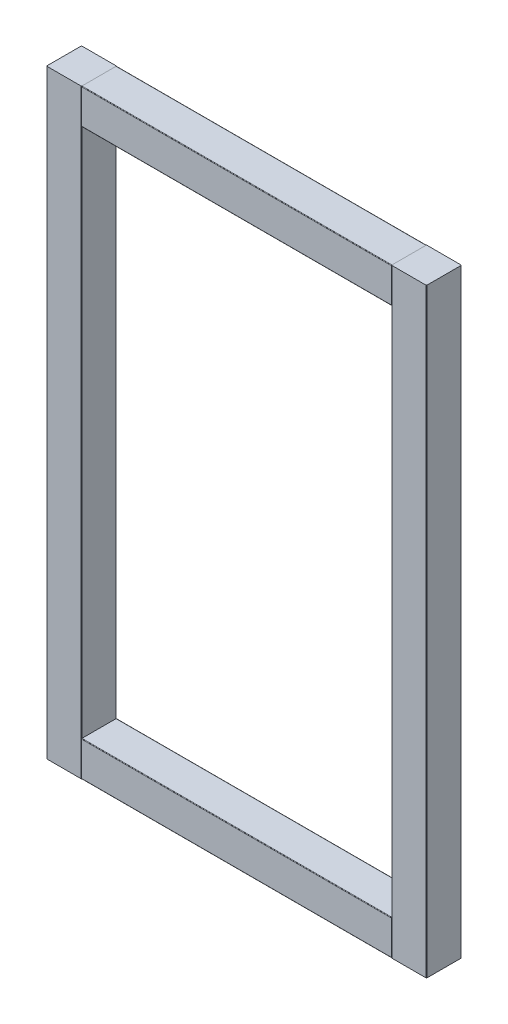
ISO-10303-21;
HEADER;
FILE_DESCRIPTION(('STEP AP214'),'2;1');
FILE_NAME('part.step','',(''),(''),'','','');
FILE_SCHEMA(('AUTOMOTIVE_DESIGN { 1 0 10303 214 1 1 1 1 }'));
ENDSEC;
DATA;
#1=APPLICATION_CONTEXT('core data for automotive mechanical design processes');
#2=APPLICATION_PROTOCOL_DEFINITION('international standard','automotive_design',2000,#1);
#3=PRODUCT_CONTEXT('',#1,'mechanical');
#4=PRODUCT('Part','Part','',(#3));
#5=PRODUCT_RELATED_PRODUCT_CATEGORY('part','',(#4));
#6=PRODUCT_DEFINITION_FORMATION('','',#4);
#7=PRODUCT_DEFINITION_CONTEXT('part definition',#1,'design');
#8=PRODUCT_DEFINITION('design','',#6,#7);
#9=PRODUCT_DEFINITION_SHAPE('','',#8);
#10=(LENGTH_UNIT() NAMED_UNIT(*) SI_UNIT(.MILLI.,.METRE.));
#11=(NAMED_UNIT(*) PLANE_ANGLE_UNIT() SI_UNIT($,.RADIAN.));
#12=(NAMED_UNIT(*) SI_UNIT($,.STERADIAN.) SOLID_ANGLE_UNIT());
#13=UNCERTAINTY_MEASURE_WITH_UNIT(LENGTH_MEASURE(1.E-05),#10,'distance_accuracy_value','');
#14=(GEOMETRIC_REPRESENTATION_CONTEXT(3) GLOBAL_UNCERTAINTY_ASSIGNED_CONTEXT((#13)) GLOBAL_UNIT_ASSIGNED_CONTEXT((#10,
#11,#12)) REPRESENTATION_CONTEXT('',''));
#15=CARTESIAN_POINT('',(0.,0.,0.));
#16=DIRECTION('',(0.,0.,1.));
#17=DIRECTION('',(1.,0.,0.));
#18=AXIS2_PLACEMENT_3D('',#15,#16,#17);
#19=CARTESIAN_POINT('',(155.5,282.5,-17.));
#20=DIRECTION('',(0.,-1.,0.));
#21=DIRECTION('',(0.,0.,-1.));
#22=AXIS2_PLACEMENT_3D('',#19,#20,#21);
#23=CYLINDRICAL_SURFACE('',#22,0.5);
#24=CARTESIAN_POINT('',(155.5,-300.,-17.));
#25=DIRECTION('',(0.,-1.,0.));
#26=DIRECTION('',(0.,0.,-1.));
#27=AXIS2_PLACEMENT_3D('',#24,#25,#26);
#28=CIRCLE('',#27,0.5);
#29=CARTESIAN_POINT('',(155.,-300.,-17.));
#30=VERTEX_POINT('',#29);
#31=CARTESIAN_POINT('',(155.5,-300.,-17.5));
#32=VERTEX_POINT('',#31);
#33=EDGE_CURVE('E161',#30,#32,#28,.T.);
#34=ORIENTED_EDGE('',*,*,#33,.F.);
#35=DIRECTION('',(0.,-1.,0.));
#36=VECTOR('',#35,1.);
#37=CARTESIAN_POINT('',(155.,282.5,-17.));
#38=LINE('',#37,#36);
#39=CARTESIAN_POINT('',(155.,300.,-17.));
#40=VERTEX_POINT('',#39);
#41=EDGE_CURVE('E203',#40,#30,#38,.T.);
#42=ORIENTED_EDGE('',*,*,#41,.F.);
#43=CARTESIAN_POINT('',(155.5,300.,-17.));
#44=DIRECTION('',(0.,1.,0.));
#45=DIRECTION('',(0.,0.,1.));
#46=AXIS2_PLACEMENT_3D('',#43,#44,#45);
#47=CIRCLE('',#46,0.5);
#48=CARTESIAN_POINT('',(155.5,300.,-17.5));
#49=VERTEX_POINT('',#48);
#50=EDGE_CURVE('E148',#49,#40,#47,.T.);
#51=ORIENTED_EDGE('',*,*,#50,.F.);
#52=DIRECTION('',(0.,-1.,0.));
#53=VECTOR('',#52,1.);
#54=CARTESIAN_POINT('',(155.5,282.5,-17.5));
#55=LINE('',#54,#53);
#56=EDGE_CURVE('E84',#49,#32,#55,.T.);
#57=ORIENTED_EDGE('',*,*,#56,.T.);
#58=EDGE_LOOP('',(#34,#42,#51,#57));
#59=FACE_BOUND('',#58,.T.);
#60=ADVANCED_FACE('F80',(#59),#23,.T.);
#61=CARTESIAN_POINT('',(155.,282.5,-17.));
#62=DIRECTION('',(1.,0.,0.));
#63=DIRECTION('',(0.,0.,-1.));
#64=AXIS2_PLACEMENT_3D('',#61,#62,#63);
#65=PLANE('',#64);
#66=DIRECTION('',(0.,0.,-1.));
#67=VECTOR('',#66,1.);
#68=CARTESIAN_POINT('',(155.,-300.,-17.));
#69=LINE('',#68,#67);
#70=CARTESIAN_POINT('',(155.,-300.,17.));
#71=VERTEX_POINT('',#70);
#72=EDGE_CURVE('E155',#71,#30,#69,.T.);
#73=ORIENTED_EDGE('',*,*,#72,.F.);
#74=DIRECTION('',(0.,-1.,0.));
#75=VECTOR('',#74,1.);
#76=CARTESIAN_POINT('',(155.,282.5,17.));
#77=LINE('',#76,#75);
#78=CARTESIAN_POINT('',(155.,300.,17.));
#79=VERTEX_POINT('',#78);
#80=EDGE_CURVE('E200',#79,#71,#77,.T.);
#81=ORIENTED_EDGE('',*,*,#80,.F.);
#82=DIRECTION('',(0.,0.,1.));
#83=VECTOR('',#82,1.);
#84=CARTESIAN_POINT('',(155.,300.,-17.));
#85=LINE('',#84,#83);
#86=EDGE_CURVE('E232',#40,#79,#85,.T.);
#87=ORIENTED_EDGE('',*,*,#86,.F.);
#88=ORIENTED_EDGE('',*,*,#41,.T.);
#89=EDGE_LOOP('',(#73,#81,#87,#88));
#90=FACE_BOUND('',#89,.T.);
#91=ADVANCED_FACE('F221',(#90),#65,.F.);
#92=CARTESIAN_POINT('',(155.5,282.5,17.));
#93=DIRECTION('',(0.,-1.,0.));
#94=DIRECTION('',(0.,0.,-1.));
#95=AXIS2_PLACEMENT_3D('',#92,#93,#94);
#96=CYLINDRICAL_SURFACE('',#95,0.5);
#97=CARTESIAN_POINT('',(155.5,-300.,17.));
#98=DIRECTION('',(0.,-1.,0.));
#99=DIRECTION('',(0.,0.,-1.));
#100=AXIS2_PLACEMENT_3D('',#97,#98,#99);
#101=CIRCLE('',#100,0.5);
#102=CARTESIAN_POINT('',(155.5,-300.,17.5));
#103=VERTEX_POINT('',#102);
#104=EDGE_CURVE('E13',#103,#71,#101,.T.);
#105=ORIENTED_EDGE('',*,*,#104,.F.);
#106=DIRECTION('',(0.,-1.,0.));
#107=VECTOR('',#106,1.);
#108=CARTESIAN_POINT('',(155.5,282.5,17.5));
#109=LINE('',#108,#107);
#110=CARTESIAN_POINT('',(155.5,300.,17.5));
#111=VERTEX_POINT('',#110);
#112=EDGE_CURVE('E196',#111,#103,#109,.T.);
#113=ORIENTED_EDGE('',*,*,#112,.F.);
#114=CARTESIAN_POINT('',(155.5,300.,17.));
#115=DIRECTION('',(0.,1.,0.));
#116=DIRECTION('',(0.,0.,1.));
#117=AXIS2_PLACEMENT_3D('',#114,#115,#116);
#118=CIRCLE('',#117,0.5);
#119=EDGE_CURVE('E228',#79,#111,#118,.T.);
#120=ORIENTED_EDGE('',*,*,#119,.F.);
#121=ORIENTED_EDGE('',*,*,#80,.T.);
#122=EDGE_LOOP('',(#105,#113,#120,#121));
#123=FACE_BOUND('',#122,.T.);
#124=ADVANCED_FACE('F225',(#123),#96,.T.);
#125=CARTESIAN_POINT('',(189.5,282.5,17.5));
#126=DIRECTION('',(0.,0.,-1.));
#127=DIRECTION('',(-1.,0.,0.));
#128=AXIS2_PLACEMENT_3D('',#125,#126,#127);
#129=PLANE('',#128);
#130=DIRECTION('',(-1.,0.,0.));
#131=VECTOR('',#130,1.);
#132=CARTESIAN_POINT('',(189.5,-300.,17.5));
#133=LINE('',#132,#131);
#134=CARTESIAN_POINT('',(189.5,-300.,17.5));
#135=VERTEX_POINT('',#134);
#136=EDGE_CURVE('E90',#135,#103,#133,.T.);
#137=ORIENTED_EDGE('',*,*,#136,.F.);
#138=DIRECTION('',(0.,-1.,0.));
#139=VECTOR('',#138,1.);
#140=CARTESIAN_POINT('',(189.5,282.5,17.5));
#141=LINE('',#140,#139);
#142=CARTESIAN_POINT('',(189.5,300.,17.5));
#143=VERTEX_POINT('',#142);
#144=EDGE_CURVE('E192',#143,#135,#141,.T.);
#145=ORIENTED_EDGE('',*,*,#144,.F.);
#146=DIRECTION('',(1.,0.,0.));
#147=VECTOR('',#146,1.);
#148=CARTESIAN_POINT('',(189.5,300.,17.5));
#149=LINE('',#148,#147);
#150=EDGE_CURVE('E231',#111,#143,#149,.T.);
#151=ORIENTED_EDGE('',*,*,#150,.F.);
#152=ORIENTED_EDGE('',*,*,#112,.T.);
#153=EDGE_LOOP('',(#137,#145,#151,#152));
#154=FACE_BOUND('',#153,.T.);
#155=ADVANCED_FACE('F249',(#154),#129,.F.);
#156=CARTESIAN_POINT('',(189.5,282.5,17.));
#157=DIRECTION('',(0.,-1.,0.));
#158=DIRECTION('',(0.,0.,-1.));
#159=AXIS2_PLACEMENT_3D('',#156,#157,#158);
#160=CYLINDRICAL_SURFACE('',#159,0.500000000000002);
#161=CARTESIAN_POINT('',(189.5,-300.,17.));
#162=DIRECTION('',(0.,-1.,0.));
#163=DIRECTION('',(0.,0.,-1.));
#164=AXIS2_PLACEMENT_3D('',#161,#162,#163);
#165=CIRCLE('',#164,0.500000000000002);
#166=CARTESIAN_POINT('',(190.,-300.,17.));
#167=VERTEX_POINT('',#166);
#168=EDGE_CURVE('E174',#167,#135,#165,.T.);
#169=ORIENTED_EDGE('',*,*,#168,.F.);
#170=DIRECTION('',(0.,-1.,0.));
#171=VECTOR('',#170,1.);
#172=CARTESIAN_POINT('',(190.,282.5,17.));
#173=LINE('',#172,#171);
#174=CARTESIAN_POINT('',(190.,300.,17.));
#175=VERTEX_POINT('',#174);
#176=EDGE_CURVE('E188',#175,#167,#173,.T.);
#177=ORIENTED_EDGE('',*,*,#176,.F.);
#178=CARTESIAN_POINT('',(189.5,300.,17.));
#179=DIRECTION('',(0.,1.,0.));
#180=DIRECTION('',(0.,0.,1.));
#181=AXIS2_PLACEMENT_3D('',#178,#179,#180);
#182=CIRCLE('',#181,0.500000000000002);
#183=EDGE_CURVE('E163',#143,#175,#182,.T.);
#184=ORIENTED_EDGE('',*,*,#183,.F.);
#185=ORIENTED_EDGE('',*,*,#144,.T.);
#186=EDGE_LOOP('',(#169,#177,#184,#185));
#187=FACE_BOUND('',#186,.T.);
#188=ADVANCED_FACE('F246',(#187),#160,.T.);
#189=CARTESIAN_POINT('',(190.,282.5,-17.));
#190=DIRECTION('',(-1.,0.,0.));
#191=DIRECTION('',(0.,0.,1.));
#192=AXIS2_PLACEMENT_3D('',#189,#190,#191);
#193=PLANE('',#192);
#194=DIRECTION('',(0.,0.,1.));
#195=VECTOR('',#194,1.);
#196=CARTESIAN_POINT('',(190.,-300.,-17.));
#197=LINE('',#196,#195);
#198=CARTESIAN_POINT('',(190.,-300.,-17.));
#199=VERTEX_POINT('',#198);
#200=EDGE_CURVE('E178',#199,#167,#197,.T.);
#201=ORIENTED_EDGE('',*,*,#200,.F.);
#202=DIRECTION('',(0.,-1.,0.));
#203=VECTOR('',#202,1.);
#204=CARTESIAN_POINT('',(190.,282.5,-17.));
#205=LINE('',#204,#203);
#206=CARTESIAN_POINT('',(190.,300.,-17.));
#207=VERTEX_POINT('',#206);
#208=EDGE_CURVE('E141',#207,#199,#205,.T.);
#209=ORIENTED_EDGE('',*,*,#208,.F.);
#210=DIRECTION('',(0.,0.,-1.));
#211=VECTOR('',#210,1.);
#212=CARTESIAN_POINT('',(190.,300.,-17.));
#213=LINE('',#212,#211);
#214=EDGE_CURVE('E153',#175,#207,#213,.T.);
#215=ORIENTED_EDGE('',*,*,#214,.F.);
#216=ORIENTED_EDGE('',*,*,#176,.T.);
#217=EDGE_LOOP('',(#201,#209,#215,#216));
#218=FACE_BOUND('',#217,.T.);
#219=ADVANCED_FACE('F254',(#218),#193,.F.);
#220=CARTESIAN_POINT('',(189.5,282.5,-17.));
#221=DIRECTION('',(0.,-1.,0.));
#222=DIRECTION('',(0.,0.,-1.));
#223=AXIS2_PLACEMENT_3D('',#220,#221,#222);
#224=CYLINDRICAL_SURFACE('',#223,0.5);
#225=CARTESIAN_POINT('',(189.5,-300.,-17.));
#226=DIRECTION('',(0.,-1.,0.));
#227=DIRECTION('',(0.,0.,-1.));
#228=AXIS2_PLACEMENT_3D('',#225,#226,#227);
#229=CIRCLE('',#228,0.5);
#230=CARTESIAN_POINT('',(189.5,-300.,-17.5));
#231=VERTEX_POINT('',#230);
#232=EDGE_CURVE('E137',#231,#199,#229,.T.);
#233=ORIENTED_EDGE('',*,*,#232,.F.);
#234=DIRECTION('',(0.,-1.,0.));
#235=VECTOR('',#234,1.);
#236=CARTESIAN_POINT('',(189.5,282.5,-17.5));
#237=LINE('',#236,#235);
#238=CARTESIAN_POINT('',(189.5,300.,-17.5));
#239=VERTEX_POINT('',#238);
#240=EDGE_CURVE('E98',#239,#231,#237,.T.);
#241=ORIENTED_EDGE('',*,*,#240,.F.);
#242=CARTESIAN_POINT('',(189.5,300.,-17.));
#243=DIRECTION('',(0.,1.,0.));
#244=DIRECTION('',(0.,0.,1.));
#245=AXIS2_PLACEMENT_3D('',#242,#243,#244);
#246=CIRCLE('',#245,0.5);
#247=EDGE_CURVE('E134',#207,#239,#246,.T.);
#248=ORIENTED_EDGE('',*,*,#247,.F.);
#249=ORIENTED_EDGE('',*,*,#208,.T.);
#250=EDGE_LOOP('',(#233,#241,#248,#249));
#251=FACE_BOUND('',#250,.T.);
#252=ADVANCED_FACE('F131',(#251),#224,.T.);
#253=CARTESIAN_POINT('',(189.5,282.5,-17.5));
#254=DIRECTION('',(0.,0.,1.));
#255=DIRECTION('',(1.,0.,0.));
#256=AXIS2_PLACEMENT_3D('',#253,#254,#255);
#257=PLANE('',#256);
#258=DIRECTION('',(1.,0.,0.));
#259=VECTOR('',#258,1.);
#260=CARTESIAN_POINT('',(189.5,-300.,-17.5));
#261=LINE('',#260,#259);
#262=EDGE_CURVE('E169',#32,#231,#261,.T.);
#263=ORIENTED_EDGE('',*,*,#262,.F.);
#264=ORIENTED_EDGE('',*,*,#56,.F.);
#265=DIRECTION('',(-1.,0.,0.));
#266=VECTOR('',#265,1.);
#267=CARTESIAN_POINT('',(189.5,300.,-17.5));
#268=LINE('',#267,#266);
#269=EDGE_CURVE('E140',#239,#49,#268,.T.);
#270=ORIENTED_EDGE('',*,*,#269,.F.);
#271=ORIENTED_EDGE('',*,*,#240,.T.);
#272=EDGE_LOOP('',(#263,#264,#270,#271));
#273=FACE_BOUND('',#272,.T.);
#274=ADVANCED_FACE('F144',(#273),#257,.F.);
#275=CARTESIAN_POINT('',(172.5,300.,17.5));
#276=DIRECTION('',(0.,1.,0.));
#277=DIRECTION('',(0.,0.,1.));
#278=AXIS2_PLACEMENT_3D('',#275,#276,#277);
#279=PLANE('',#278);
#280=ORIENTED_EDGE('',*,*,#269,.T.);
#281=ORIENTED_EDGE('',*,*,#50,.T.);
#282=ORIENTED_EDGE('',*,*,#86,.T.);
#283=ORIENTED_EDGE('',*,*,#119,.T.);
#284=ORIENTED_EDGE('',*,*,#150,.T.);
#285=ORIENTED_EDGE('',*,*,#183,.T.);
#286=ORIENTED_EDGE('',*,*,#214,.T.);
#287=ORIENTED_EDGE('',*,*,#247,.T.);
#288=EDGE_LOOP('',(#280,#281,#282,#283,#284,#285,#286,#287));
#289=FACE_BOUND('',#288,.T.);
#290=ADVANCED_FACE('F151',(#289),#279,.T.);
#291=CARTESIAN_POINT('',(172.5,-300.,-17.5));
#292=DIRECTION('',(0.,-1.,0.));
#293=DIRECTION('',(0.,0.,-1.));
#294=AXIS2_PLACEMENT_3D('',#291,#292,#293);
#295=PLANE('',#294);
#296=ORIENTED_EDGE('',*,*,#72,.T.);
#297=ORIENTED_EDGE('',*,*,#33,.T.);
#298=ORIENTED_EDGE('',*,*,#262,.T.);
#299=ORIENTED_EDGE('',*,*,#232,.T.);
#300=ORIENTED_EDGE('',*,*,#200,.T.);
#301=ORIENTED_EDGE('',*,*,#168,.T.);
#302=ORIENTED_EDGE('',*,*,#136,.T.);
#303=ORIENTED_EDGE('',*,*,#104,.T.);
#304=EDGE_LOOP('',(#296,#297,#298,#299,#300,#301,#302,#303));
#305=FACE_BOUND('',#304,.T.);
#306=ADVANCED_FACE('F82',(#305),#295,.T.);
#307=CLOSED_SHELL('',(#60,#91,#124,#155,#188,#219,#252,#274,#290,#306));
#308=MANIFOLD_SOLID_BREP('B2',#307);
#309=CARTESIAN_POINT('',(-155.,282.5,-17.));
#310=DIRECTION('',(-1.,0.,0.));
#311=DIRECTION('',(0.,-1.,0.));
#312=AXIS2_PLACEMENT_3D('',#309,#310,#311);
#313=PLANE('',#312);
#314=CARTESIAN_POINT('',(-155.,-299.5,-17.));
#315=DIRECTION('',(-1.,0.,0.));
#316=DIRECTION('',(0.,-1.,0.));
#317=AXIS2_PLACEMENT_3D('',#314,#315,#316);
#318=CIRCLE('',#317,0.5);
#319=CARTESIAN_POINT('',(-155.,-299.5,-17.5));
#320=VERTEX_POINT('',#319);
#321=CARTESIAN_POINT('',(-155.,-300.,-17.));
#322=VERTEX_POINT('',#321);
#323=EDGE_CURVE('E512',#320,#322,#318,.T.);
#324=ORIENTED_EDGE('',*,*,#323,.T.);
#325=DIRECTION('',(0.,0.,1.));
#326=VECTOR('',#325,1.);
#327=CARTESIAN_POINT('',(-155.,-300.,-17.));
#328=LINE('',#327,#326);
#329=CARTESIAN_POINT('',(-155.,-300.,17.));
#330=VERTEX_POINT('',#329);
#331=EDGE_CURVE('E517',#322,#330,#328,.T.);
#332=ORIENTED_EDGE('',*,*,#331,.T.);
#333=CARTESIAN_POINT('',(-155.,-299.5,17.));
#334=DIRECTION('',(-1.,0.,0.));
#335=DIRECTION('',(0.,-1.,0.));
#336=AXIS2_PLACEMENT_3D('',#333,#334,#335);
#337=CIRCLE('',#336,0.5);
#338=CARTESIAN_POINT('',(-155.,-299.5,17.5));
#339=VERTEX_POINT('',#338);
#340=EDGE_CURVE('E545',#330,#339,#337,.T.);
#341=ORIENTED_EDGE('',*,*,#340,.T.);
#342=DIRECTION('',(0.,-1.,0.));
#343=VECTOR('',#342,1.);
#344=CARTESIAN_POINT('',(-155.,282.5,17.5));
#345=LINE('',#344,#343);
#346=CARTESIAN_POINT('',(-155.,-265.5,17.5));
#347=VERTEX_POINT('',#346);
#348=EDGE_CURVE('E462',#347,#339,#345,.T.);
#349=ORIENTED_EDGE('',*,*,#348,.F.);
#350=CARTESIAN_POINT('',(-155.,-265.5,17.));
#351=DIRECTION('',(-1.,0.,0.));
#352=DIRECTION('',(0.,-1.,0.));
#353=AXIS2_PLACEMENT_3D('',#350,#351,#352);
#354=CIRCLE('',#353,0.500000000000002);
#355=CARTESIAN_POINT('',(-155.,-265.,17.));
#356=VERTEX_POINT('',#355);
#357=EDGE_CURVE('E465',#347,#356,#354,.T.);
#358=ORIENTED_EDGE('',*,*,#357,.T.);
#359=DIRECTION('',(0.,0.,-1.));
#360=VECTOR('',#359,1.);
#361=CARTESIAN_POINT('',(-155.,-265.,-17.));
#362=LINE('',#361,#360);
#363=CARTESIAN_POINT('',(-155.,-265.,-17.));
#364=VERTEX_POINT('',#363);
#365=EDGE_CURVE('E550',#356,#364,#362,.T.);
#366=ORIENTED_EDGE('',*,*,#365,.T.);
#367=CARTESIAN_POINT('',(-155.,-265.5,-17.));
#368=DIRECTION('',(-1.,0.,0.));
#369=DIRECTION('',(0.,-1.,0.));
#370=AXIS2_PLACEMENT_3D('',#367,#368,#369);
#371=CIRCLE('',#370,0.5);
#372=CARTESIAN_POINT('',(-155.,-265.5,-17.5));
#373=VERTEX_POINT('',#372);
#374=EDGE_CURVE('E541',#364,#373,#371,.T.);
#375=ORIENTED_EDGE('',*,*,#374,.T.);
#376=DIRECTION('',(0.,-1.,0.));
#377=VECTOR('',#376,1.);
#378=CARTESIAN_POINT('',(-155.,-265.5,-17.5));
#379=LINE('',#378,#377);
#380=EDGE_CURVE('E433',#373,#320,#379,.T.);
#381=ORIENTED_EDGE('',*,*,#380,.T.);
#382=EDGE_LOOP('',(#324,#332,#341,#349,#358,#366,#375,#381));
#383=FACE_BOUND('',#382,.T.);
#384=ADVANCED_FACE('F424',(#383),#313,.T.);
#385=CARTESIAN_POINT('',(-172.5,-265.5,-17.5));
#386=DIRECTION('',(0.,0.,1.));
#387=DIRECTION('',(1.,0.,0.));
#388=AXIS2_PLACEMENT_3D('',#385,#386,#387);
#389=PLANE('',#388);
#390=DIRECTION('',(0.,1.,0.));
#391=VECTOR('',#390,1.);
#392=CARTESIAN_POINT('',(155.,-265.5,-17.5));
#393=LINE('',#392,#391);
#394=CARTESIAN_POINT('',(155.,-299.5,-17.5));
#395=VERTEX_POINT('',#394);
#396=CARTESIAN_POINT('',(155.,-265.5,-17.5));
#397=VERTEX_POINT('',#396);
#398=EDGE_CURVE('E78',#395,#397,#393,.T.);
#399=ORIENTED_EDGE('',*,*,#398,.F.);
#400=DIRECTION('',(1.,0.,0.));
#401=VECTOR('',#400,1.);
#402=CARTESIAN_POINT('',(-172.5,-299.5,-17.5));
#403=LINE('',#402,#401);
#404=EDGE_CURVE('E522',#320,#395,#403,.T.);
#405=ORIENTED_EDGE('',*,*,#404,.F.);
#406=ORIENTED_EDGE('',*,*,#380,.F.);
#407=DIRECTION('',(1.,0.,0.));
#408=VECTOR('',#407,1.);
#409=CARTESIAN_POINT('',(-172.5,-265.5,-17.5));
#410=LINE('',#409,#408);
#411=EDGE_CURVE('E503',#373,#397,#410,.T.);
#412=ORIENTED_EDGE('',*,*,#411,.T.);
#413=EDGE_LOOP('',(#399,#405,#406,#412));
#414=FACE_BOUND('',#413,.T.);
#415=ADVANCED_FACE('F510',(#414),#389,.F.);
#416=CARTESIAN_POINT('',(-172.5,-265.5,-17.));
#417=DIRECTION('',(1.,0.,0.));
#418=DIRECTION('',(0.,1.,0.));
#419=AXIS2_PLACEMENT_3D('',#416,#417,#418);
#420=CYLINDRICAL_SURFACE('',#419,0.5);
#421=CARTESIAN_POINT('',(155.,-265.5,-17.));
#422=DIRECTION('',(1.,0.,0.));
#423=DIRECTION('',(0.,0.,-1.));
#424=AXIS2_PLACEMENT_3D('',#421,#422,#423);
#425=CIRCLE('',#424,0.5);
#426=CARTESIAN_POINT('',(155.,-265.,-17.));
#427=VERTEX_POINT('',#426);
#428=EDGE_CURVE('E492',#397,#427,#425,.T.);
#429=ORIENTED_EDGE('',*,*,#428,.F.);
#430=ORIENTED_EDGE('',*,*,#411,.F.);
#431=ORIENTED_EDGE('',*,*,#374,.F.);
#432=DIRECTION('',(1.,0.,0.));
#433=VECTOR('',#432,1.);
#434=CARTESIAN_POINT('',(-172.5,-265.,-17.));
#435=LINE('',#434,#433);
#436=EDGE_CURVE('E505',#364,#427,#435,.T.);
#437=ORIENTED_EDGE('',*,*,#436,.T.);
#438=EDGE_LOOP('',(#429,#430,#431,#437));
#439=FACE_BOUND('',#438,.T.);
#440=ADVANCED_FACE('F501',(#439),#420,.T.);
#441=CARTESIAN_POINT('',(-172.5,-265.,-17.));
#442=DIRECTION('',(0.,-1.,0.));
#443=DIRECTION('',(1.,0.,0.));
#444=AXIS2_PLACEMENT_3D('',#441,#442,#443);
#445=PLANE('',#444);
#446=DIRECTION('',(0.,0.,1.));
#447=VECTOR('',#446,1.);
#448=CARTESIAN_POINT('',(155.,-265.,-17.));
#449=LINE('',#448,#447);
#450=CARTESIAN_POINT('',(155.,-265.,17.));
#451=VERTEX_POINT('',#450);
#452=EDGE_CURVE('E507',#427,#451,#449,.T.);
#453=ORIENTED_EDGE('',*,*,#452,.F.);
#454=ORIENTED_EDGE('',*,*,#436,.F.);
#455=ORIENTED_EDGE('',*,*,#365,.F.);
#456=DIRECTION('',(1.,0.,0.));
#457=VECTOR('',#456,1.);
#458=CARTESIAN_POINT('',(-172.5,-265.,17.));
#459=LINE('',#458,#457);
#460=EDGE_CURVE('E519',#356,#451,#459,.T.);
#461=ORIENTED_EDGE('',*,*,#460,.T.);
#462=EDGE_LOOP('',(#453,#454,#455,#461));
#463=FACE_BOUND('',#462,.T.);
#464=ADVANCED_FACE('F572',(#463),#445,.F.);
#465=CARTESIAN_POINT('',(-172.5,-265.5,17.));
#466=DIRECTION('',(1.,0.,0.));
#467=DIRECTION('',(0.,1.,0.));
#468=AXIS2_PLACEMENT_3D('',#465,#466,#467);
#469=CYLINDRICAL_SURFACE('',#468,0.500000000000002);
#470=CARTESIAN_POINT('',(155.,-265.5,17.));
#471=DIRECTION('',(1.,0.,0.));
#472=DIRECTION('',(0.,0.,-1.));
#473=AXIS2_PLACEMENT_3D('',#470,#471,#472);
#474=CIRCLE('',#473,0.500000000000002);
#475=CARTESIAN_POINT('',(155.,-265.5,17.5));
#476=VERTEX_POINT('',#475);
#477=EDGE_CURVE('E577',#451,#476,#474,.T.);
#478=ORIENTED_EDGE('',*,*,#477,.F.);
#479=ORIENTED_EDGE('',*,*,#460,.F.);
#480=ORIENTED_EDGE('',*,*,#357,.F.);
#481=DIRECTION('',(1.,0.,0.));
#482=VECTOR('',#481,1.);
#483=CARTESIAN_POINT('',(-172.5,-265.5,17.5));
#484=LINE('',#483,#482);
#485=EDGE_CURVE('E564',#347,#476,#484,.T.);
#486=ORIENTED_EDGE('',*,*,#485,.T.);
#487=EDGE_LOOP('',(#478,#479,#480,#486));
#488=FACE_BOUND('',#487,.T.);
#489=ADVANCED_FACE('F575',(#488),#469,.T.);
#490=CARTESIAN_POINT('',(-172.5,-265.5,17.5));
#491=DIRECTION('',(0.,0.,-1.));
#492=DIRECTION('',(0.,1.,0.));
#493=AXIS2_PLACEMENT_3D('',#490,#491,#492);
#494=PLANE('',#493);
#495=DIRECTION('',(0.,-1.,0.));
#496=VECTOR('',#495,1.);
#497=CARTESIAN_POINT('',(155.,282.5,17.5));
#498=LINE('',#497,#496);
#499=CARTESIAN_POINT('',(155.,-299.5,17.5));
#500=VERTEX_POINT('',#499);
#501=EDGE_CURVE('E508',#476,#500,#498,.T.);
#502=ORIENTED_EDGE('',*,*,#501,.F.);
#503=ORIENTED_EDGE('',*,*,#485,.F.);
#504=ORIENTED_EDGE('',*,*,#348,.T.);
#505=DIRECTION('',(1.,0.,0.));
#506=VECTOR('',#505,1.);
#507=CARTESIAN_POINT('',(-172.5,-299.5,17.5));
#508=LINE('',#507,#506);
#509=EDGE_CURVE('E556',#339,#500,#508,.T.);
#510=ORIENTED_EDGE('',*,*,#509,.T.);
#511=EDGE_LOOP('',(#502,#503,#504,#510));
#512=FACE_BOUND('',#511,.T.);
#513=ADVANCED_FACE('F596',(#512),#494,.F.);
#514=CARTESIAN_POINT('',(-172.5,-299.5,17.));
#515=DIRECTION('',(1.,0.,0.));
#516=DIRECTION('',(0.,1.,0.));
#517=AXIS2_PLACEMENT_3D('',#514,#515,#516);
#518=CYLINDRICAL_SURFACE('',#517,0.5);
#519=CARTESIAN_POINT('',(155.,-299.5,17.));
#520=DIRECTION('',(1.,0.,0.));
#521=DIRECTION('',(0.,0.,-1.));
#522=AXIS2_PLACEMENT_3D('',#519,#520,#521);
#523=CIRCLE('',#522,0.5);
#524=CARTESIAN_POINT('',(155.,-300.,17.));
#525=VERTEX_POINT('',#524);
#526=EDGE_CURVE('E536',#500,#525,#523,.T.);
#527=ORIENTED_EDGE('',*,*,#526,.F.);
#528=ORIENTED_EDGE('',*,*,#509,.F.);
#529=ORIENTED_EDGE('',*,*,#340,.F.);
#530=DIRECTION('',(1.,0.,0.));
#531=VECTOR('',#530,1.);
#532=CARTESIAN_POINT('',(-172.5,-300.,17.));
#533=LINE('',#532,#531);
#534=EDGE_CURVE('E530',#330,#525,#533,.T.);
#535=ORIENTED_EDGE('',*,*,#534,.T.);
#536=EDGE_LOOP('',(#527,#528,#529,#535));
#537=FACE_BOUND('',#536,.T.);
#538=ADVANCED_FACE('F593',(#537),#518,.T.);
#539=CARTESIAN_POINT('',(-172.5,-300.,-17.));
#540=DIRECTION('',(0.,1.,0.));
#541=DIRECTION('',(-1.,0.,0.));
#542=AXIS2_PLACEMENT_3D('',#539,#540,#541);
#543=PLANE('',#542);
#544=DIRECTION('',(0.,0.,-1.));
#545=VECTOR('',#544,1.);
#546=CARTESIAN_POINT('',(155.,-300.,-17.));
#547=LINE('',#546,#545);
#548=CARTESIAN_POINT('',(155.,-300.,-17.));
#549=VERTEX_POINT('',#548);
#550=EDGE_CURVE('E532',#525,#549,#547,.T.);
#551=ORIENTED_EDGE('',*,*,#550,.F.);
#552=ORIENTED_EDGE('',*,*,#534,.F.);
#553=ORIENTED_EDGE('',*,*,#331,.F.);
#554=DIRECTION('',(1.,0.,0.));
#555=VECTOR('',#554,1.);
#556=CARTESIAN_POINT('',(-172.5,-300.,-17.));
#557=LINE('',#556,#555);
#558=EDGE_CURVE('E524',#322,#549,#557,.T.);
#559=ORIENTED_EDGE('',*,*,#558,.T.);
#560=EDGE_LOOP('',(#551,#552,#553,#559));
#561=FACE_BOUND('',#560,.T.);
#562=ADVANCED_FACE('F603',(#561),#543,.F.);
#563=CARTESIAN_POINT('',(-172.5,-299.5,-17.));
#564=DIRECTION('',(1.,0.,0.));
#565=DIRECTION('',(0.,1.,0.));
#566=AXIS2_PLACEMENT_3D('',#563,#564,#565);
#567=CYLINDRICAL_SURFACE('',#566,0.5);
#568=CARTESIAN_POINT('',(155.,-299.5,-17.));
#569=DIRECTION('',(1.,0.,0.));
#570=DIRECTION('',(0.,0.,-1.));
#571=AXIS2_PLACEMENT_3D('',#568,#569,#570);
#572=CIRCLE('',#571,0.5);
#573=EDGE_CURVE('E439',#549,#395,#572,.T.);
#574=ORIENTED_EDGE('',*,*,#573,.F.);
#575=ORIENTED_EDGE('',*,*,#558,.F.);
#576=ORIENTED_EDGE('',*,*,#323,.F.);
#577=ORIENTED_EDGE('',*,*,#404,.T.);
#578=EDGE_LOOP('',(#574,#575,#576,#577));
#579=FACE_BOUND('',#578,.T.);
#580=ADVANCED_FACE('F426',(#579),#567,.T.);
#581=CARTESIAN_POINT('',(155.,282.5,-17.));
#582=DIRECTION('',(1.,0.,0.));
#583=DIRECTION('',(0.,0.,-1.));
#584=AXIS2_PLACEMENT_3D('',#581,#582,#583);
#585=PLANE('',#584);
#586=ORIENTED_EDGE('',*,*,#573,.T.);
#587=ORIENTED_EDGE('',*,*,#398,.T.);
#588=ORIENTED_EDGE('',*,*,#428,.T.);
#589=ORIENTED_EDGE('',*,*,#452,.T.);
#590=ORIENTED_EDGE('',*,*,#477,.T.);
#591=ORIENTED_EDGE('',*,*,#501,.T.);
#592=ORIENTED_EDGE('',*,*,#526,.T.);
#593=ORIENTED_EDGE('',*,*,#550,.T.);
#594=EDGE_LOOP('',(#586,#587,#588,#589,#590,#591,#592,#593));
#595=FACE_BOUND('',#594,.T.);
#596=ADVANCED_FACE('F491',(#595),#585,.T.);
#597=CLOSED_SHELL('',(#384,#415,#440,#464,#489,#513,#538,#562,#580,#596));
#598=MANIFOLD_SOLID_BREP('B7',#597);
#599=CARTESIAN_POINT('',(-155.,282.5,-17.));
#600=DIRECTION('',(-1.,0.,0.));
#601=DIRECTION('',(0.,-1.,0.));
#602=AXIS2_PLACEMENT_3D('',#599,#600,#601);
#603=PLANE('',#602);
#604=CARTESIAN_POINT('',(-155.,265.5,-17.));
#605=DIRECTION('',(-1.,0.,0.));
#606=DIRECTION('',(0.,-1.,0.));
#607=AXIS2_PLACEMENT_3D('',#604,#605,#606);
#608=CIRCLE('',#607,0.5);
#609=CARTESIAN_POINT('',(-155.,265.5,-17.5));
#610=VERTEX_POINT('',#609);
#611=CARTESIAN_POINT('',(-155.,265.,-17.));
#612=VERTEX_POINT('',#611);
#613=EDGE_CURVE('E875',#610,#612,#608,.T.);
#614=ORIENTED_EDGE('',*,*,#613,.T.);
#615=DIRECTION('',(0.,0.,1.));
#616=VECTOR('',#615,1.);
#617=CARTESIAN_POINT('',(-155.,265.,-17.));
#618=LINE('',#617,#616);
#619=CARTESIAN_POINT('',(-155.,265.,17.));
#620=VERTEX_POINT('',#619);
#621=EDGE_CURVE('E900',#612,#620,#618,.T.);
#622=ORIENTED_EDGE('',*,*,#621,.T.);
#623=CARTESIAN_POINT('',(-155.,265.5,17.));
#624=DIRECTION('',(-1.,0.,0.));
#625=DIRECTION('',(0.,-1.,0.));
#626=AXIS2_PLACEMENT_3D('',#623,#624,#625);
#627=CIRCLE('',#626,0.5);
#628=CARTESIAN_POINT('',(-155.,265.5,17.5));
#629=VERTEX_POINT('',#628);
#630=EDGE_CURVE('E903',#620,#629,#627,.T.);
#631=ORIENTED_EDGE('',*,*,#630,.T.);
#632=DIRECTION('',(0.,-1.,0.));
#633=VECTOR('',#632,1.);
#634=CARTESIAN_POINT('',(-155.,282.5,17.5));
#635=LINE('',#634,#633);
#636=CARTESIAN_POINT('',(-155.,299.5,17.5));
#637=VERTEX_POINT('',#636);
#638=EDGE_CURVE('E865',#637,#629,#635,.T.);
#639=ORIENTED_EDGE('',*,*,#638,.F.);
#640=CARTESIAN_POINT('',(-155.,299.5,17.));
#641=DIRECTION('',(-1.,0.,0.));
#642=DIRECTION('',(0.,-1.,0.));
#643=AXIS2_PLACEMENT_3D('',#640,#641,#642);
#644=CIRCLE('',#643,0.500000000000002);
#645=CARTESIAN_POINT('',(-155.,300.,17.));
#646=VERTEX_POINT('',#645);
#647=EDGE_CURVE('E856',#637,#646,#644,.T.);
#648=ORIENTED_EDGE('',*,*,#647,.T.);
#649=DIRECTION('',(0.,0.,-1.));
#650=VECTOR('',#649,1.);
#651=CARTESIAN_POINT('',(-155.,300.,-17.));
#652=LINE('',#651,#650);
#653=CARTESIAN_POINT('',(-155.,300.,-17.));
#654=VERTEX_POINT('',#653);
#655=EDGE_CURVE('E908',#646,#654,#652,.T.);
#656=ORIENTED_EDGE('',*,*,#655,.T.);
#657=CARTESIAN_POINT('',(-155.,299.5,-17.));
#658=DIRECTION('',(-1.,0.,0.));
#659=DIRECTION('',(0.,-1.,0.));
#660=AXIS2_PLACEMENT_3D('',#657,#658,#659);
#661=CIRCLE('',#660,0.5);
#662=CARTESIAN_POINT('',(-155.,299.5,-17.5));
#663=VERTEX_POINT('',#662);
#664=EDGE_CURVE('E897',#654,#663,#661,.T.);
#665=ORIENTED_EDGE('',*,*,#664,.T.);
#666=DIRECTION('',(0.,-1.,0.));
#667=VECTOR('',#666,1.);
#668=CARTESIAN_POINT('',(-155.,299.5,-17.5));
#669=LINE('',#668,#667);
#670=EDGE_CURVE('E776',#663,#610,#669,.T.);
#671=ORIENTED_EDGE('',*,*,#670,.T.);
#672=EDGE_LOOP('',(#614,#622,#631,#639,#648,#656,#665,#671));
#673=FACE_BOUND('',#672,.T.);
#674=ADVANCED_FACE('F767',(#673),#603,.T.);
#675=CARTESIAN_POINT('',(-172.5,299.5,-17.5));
#676=DIRECTION('',(0.,0.,1.));
#677=DIRECTION('',(1.,0.,0.));
#678=AXIS2_PLACEMENT_3D('',#675,#676,#677);
#679=PLANE('',#678);
#680=DIRECTION('',(0.,1.,0.));
#681=VECTOR('',#680,1.);
#682=CARTESIAN_POINT('',(155.,299.5,-17.5));
#683=LINE('',#682,#681);
#684=CARTESIAN_POINT('',(155.,265.5,-17.5));
#685=VERTEX_POINT('',#684);
#686=CARTESIAN_POINT('',(155.,299.5,-17.5));
#687=VERTEX_POINT('',#686);
#688=EDGE_CURVE('E422',#685,#687,#683,.T.);
#689=ORIENTED_EDGE('',*,*,#688,.F.);
#690=DIRECTION('',(1.,0.,0.));
#691=VECTOR('',#690,1.);
#692=CARTESIAN_POINT('',(-172.5,265.5,-17.5));
#693=LINE('',#692,#691);
#694=EDGE_CURVE('E876',#610,#685,#693,.T.);
#695=ORIENTED_EDGE('',*,*,#694,.F.);
#696=ORIENTED_EDGE('',*,*,#670,.F.);
#697=DIRECTION('',(1.,0.,0.));
#698=VECTOR('',#697,1.);
#699=CARTESIAN_POINT('',(-172.5,299.5,-17.5));
#700=LINE('',#699,#698);
#701=EDGE_CURVE('E872',#663,#687,#700,.T.);
#702=ORIENTED_EDGE('',*,*,#701,.T.);
#703=EDGE_LOOP('',(#689,#695,#696,#702));
#704=FACE_BOUND('',#703,.T.);
#705=ADVANCED_FACE('F927',(#704),#679,.F.);
#706=CARTESIAN_POINT('',(-172.5,299.5,-17.));
#707=DIRECTION('',(1.,0.,0.));
#708=DIRECTION('',(0.,0.,-1.));
#709=AXIS2_PLACEMENT_3D('',#706,#707,#708);
#710=CYLINDRICAL_SURFACE('',#709,0.5);
#711=CARTESIAN_POINT('',(155.,299.5,-17.));
#712=DIRECTION('',(1.,0.,0.));
#713=DIRECTION('',(0.,0.,-1.));
#714=AXIS2_PLACEMENT_3D('',#711,#712,#713);
#715=CIRCLE('',#714,0.5);
#716=CARTESIAN_POINT('',(155.,300.,-17.));
#717=VERTEX_POINT('',#716);
#718=EDGE_CURVE('E852',#687,#717,#715,.T.);
#719=ORIENTED_EDGE('',*,*,#718,.F.);
#720=ORIENTED_EDGE('',*,*,#701,.F.);
#721=ORIENTED_EDGE('',*,*,#664,.F.);
#722=DIRECTION('',(1.,0.,0.));
#723=VECTOR('',#722,1.);
#724=CARTESIAN_POINT('',(-172.5,300.,-17.));
#725=LINE('',#724,#723);
#726=EDGE_CURVE('E863',#654,#717,#725,.T.);
#727=ORIENTED_EDGE('',*,*,#726,.T.);
#728=EDGE_LOOP('',(#719,#720,#721,#727));
#729=FACE_BOUND('',#728,.T.);
#730=ADVANCED_FACE('F931',(#729),#710,.T.);
#731=CARTESIAN_POINT('',(-172.5,300.,-17.));
#732=DIRECTION('',(0.,-1.,0.));
#733=DIRECTION('',(0.,0.,-1.));
#734=AXIS2_PLACEMENT_3D('',#731,#732,#733);
#735=PLANE('',#734);
#736=DIRECTION('',(0.,0.,1.));
#737=VECTOR('',#736,1.);
#738=CARTESIAN_POINT('',(155.,300.,-17.));
#739=LINE('',#738,#737);
#740=CARTESIAN_POINT('',(155.,300.,17.));
#741=VERTEX_POINT('',#740);
#742=EDGE_CURVE('E835',#717,#741,#739,.T.);
#743=ORIENTED_EDGE('',*,*,#742,.F.);
#744=ORIENTED_EDGE('',*,*,#726,.F.);
#745=ORIENTED_EDGE('',*,*,#655,.F.);
#746=DIRECTION('',(1.,0.,0.));
#747=VECTOR('',#746,1.);
#748=CARTESIAN_POINT('',(-172.5,300.,17.));
#749=LINE('',#748,#747);
#750=EDGE_CURVE('E858',#646,#741,#749,.T.);
#751=ORIENTED_EDGE('',*,*,#750,.T.);
#752=EDGE_LOOP('',(#743,#744,#745,#751));
#753=FACE_BOUND('',#752,.T.);
#754=ADVANCED_FACE('F947',(#753),#735,.F.);
#755=CARTESIAN_POINT('',(-172.5,299.5,17.));
#756=DIRECTION('',(1.,0.,0.));
#757=DIRECTION('',(0.,0.,-1.));
#758=AXIS2_PLACEMENT_3D('',#755,#756,#757);
#759=CYLINDRICAL_SURFACE('',#758,0.500000000000002);
#760=CARTESIAN_POINT('',(155.,299.5,17.));
#761=DIRECTION('',(1.,0.,0.));
#762=DIRECTION('',(0.,0.,-1.));
#763=AXIS2_PLACEMENT_3D('',#760,#761,#762);
#764=CIRCLE('',#763,0.500000000000002);
#765=CARTESIAN_POINT('',(155.,299.5,17.5));
#766=VERTEX_POINT('',#765);
#767=EDGE_CURVE('E829',#741,#766,#764,.T.);
#768=ORIENTED_EDGE('',*,*,#767,.F.);
#769=ORIENTED_EDGE('',*,*,#750,.F.);
#770=ORIENTED_EDGE('',*,*,#647,.F.);
#771=DIRECTION('',(1.,0.,0.));
#772=VECTOR('',#771,1.);
#773=CARTESIAN_POINT('',(-172.5,299.5,17.5));
#774=LINE('',#773,#772);
#775=EDGE_CURVE('E848',#637,#766,#774,.T.);
#776=ORIENTED_EDGE('',*,*,#775,.T.);
#777=EDGE_LOOP('',(#768,#769,#770,#776));
#778=FACE_BOUND('',#777,.T.);
#779=ADVANCED_FACE('F855',(#778),#759,.T.);
#780=CARTESIAN_POINT('',(-172.5,299.5,17.5));
#781=DIRECTION('',(0.,0.,-1.));
#782=DIRECTION('',(0.,1.,0.));
#783=AXIS2_PLACEMENT_3D('',#780,#781,#782);
#784=PLANE('',#783);
#785=DIRECTION('',(0.,-1.,0.));
#786=VECTOR('',#785,1.);
#787=CARTESIAN_POINT('',(155.,282.5,17.5));
#788=LINE('',#787,#786);
#789=CARTESIAN_POINT('',(155.,265.5,17.5));
#790=VERTEX_POINT('',#789);
#791=EDGE_CURVE('E832',#766,#790,#788,.T.);
#792=ORIENTED_EDGE('',*,*,#791,.F.);
#793=ORIENTED_EDGE('',*,*,#775,.F.);
#794=ORIENTED_EDGE('',*,*,#638,.T.);
#795=DIRECTION('',(1.,0.,0.));
#796=VECTOR('',#795,1.);
#797=CARTESIAN_POINT('',(-172.5,265.5,17.5));
#798=LINE('',#797,#796);
#799=EDGE_CURVE('E850',#629,#790,#798,.T.);
#800=ORIENTED_EDGE('',*,*,#799,.T.);
#801=EDGE_LOOP('',(#792,#793,#794,#800));
#802=FACE_BOUND('',#801,.T.);
#803=ADVANCED_FACE('F846',(#802),#784,.F.);
#804=CARTESIAN_POINT('',(-172.5,265.5,17.));
#805=DIRECTION('',(1.,0.,0.));
#806=DIRECTION('',(0.,0.,-1.));
#807=AXIS2_PLACEMENT_3D('',#804,#805,#806);
#808=CYLINDRICAL_SURFACE('',#807,0.5);
#809=CARTESIAN_POINT('',(155.,265.5,17.));
#810=DIRECTION('',(1.,0.,0.));
#811=DIRECTION('',(0.,0.,-1.));
#812=AXIS2_PLACEMENT_3D('',#809,#810,#811);
#813=CIRCLE('',#812,0.5);
#814=CARTESIAN_POINT('',(155.,265.,17.));
#815=VERTEX_POINT('',#814);
#816=EDGE_CURVE('E841',#790,#815,#813,.T.);
#817=ORIENTED_EDGE('',*,*,#816,.F.);
#818=ORIENTED_EDGE('',*,*,#799,.F.);
#819=ORIENTED_EDGE('',*,*,#630,.F.);
#820=DIRECTION('',(1.,0.,0.));
#821=VECTOR('',#820,1.);
#822=CARTESIAN_POINT('',(-172.5,265.,17.));
#823=LINE('',#822,#821);
#824=EDGE_CURVE('E886',#620,#815,#823,.T.);
#825=ORIENTED_EDGE('',*,*,#824,.T.);
#826=EDGE_LOOP('',(#817,#818,#819,#825));
#827=FACE_BOUND('',#826,.T.);
#828=ADVANCED_FACE('F920',(#827),#808,.T.);
#829=CARTESIAN_POINT('',(-172.5,265.,-17.));
#830=DIRECTION('',(0.,1.,0.));
#831=DIRECTION('',(0.,0.,1.));
#832=AXIS2_PLACEMENT_3D('',#829,#830,#831);
#833=PLANE('',#832);
#834=DIRECTION('',(0.,0.,-1.));
#835=VECTOR('',#834,1.);
#836=CARTESIAN_POINT('',(155.,265.,-17.));
#837=LINE('',#836,#835);
#838=CARTESIAN_POINT('',(155.,265.,-17.));
#839=VERTEX_POINT('',#838);
#840=EDGE_CURVE('E888',#815,#839,#837,.T.);
#841=ORIENTED_EDGE('',*,*,#840,.F.);
#842=ORIENTED_EDGE('',*,*,#824,.F.);
#843=ORIENTED_EDGE('',*,*,#621,.F.);
#844=DIRECTION('',(1.,0.,0.));
#845=VECTOR('',#844,1.);
#846=CARTESIAN_POINT('',(-172.5,265.,-17.));
#847=LINE('',#846,#845);
#848=EDGE_CURVE('E879',#612,#839,#847,.T.);
#849=ORIENTED_EDGE('',*,*,#848,.T.);
#850=EDGE_LOOP('',(#841,#842,#843,#849));
#851=FACE_BOUND('',#850,.T.);
#852=ADVANCED_FACE('F924',(#851),#833,.F.);
#853=CARTESIAN_POINT('',(-172.5,265.5,-17.));
#854=DIRECTION('',(1.,0.,0.));
#855=DIRECTION('',(0.,0.,-1.));
#856=AXIS2_PLACEMENT_3D('',#853,#854,#855);
#857=CYLINDRICAL_SURFACE('',#856,0.5);
#858=CARTESIAN_POINT('',(155.,265.5,-17.));
#859=DIRECTION('',(1.,0.,0.));
#860=DIRECTION('',(0.,0.,-1.));
#861=AXIS2_PLACEMENT_3D('',#858,#859,#860);
#862=CIRCLE('',#861,0.5);
#863=EDGE_CURVE('E782',#839,#685,#862,.T.);
#864=ORIENTED_EDGE('',*,*,#863,.F.);
#865=ORIENTED_EDGE('',*,*,#848,.F.);
#866=ORIENTED_EDGE('',*,*,#613,.F.);
#867=ORIENTED_EDGE('',*,*,#694,.T.);
#868=EDGE_LOOP('',(#864,#865,#866,#867));
#869=FACE_BOUND('',#868,.T.);
#870=ADVANCED_FACE('F769',(#869),#857,.T.);
#871=CARTESIAN_POINT('',(155.,282.5,-17.));
#872=DIRECTION('',(1.,0.,0.));
#873=DIRECTION('',(0.,0.,-1.));
#874=AXIS2_PLACEMENT_3D('',#871,#872,#873);
#875=PLANE('',#874);
#876=ORIENTED_EDGE('',*,*,#863,.T.);
#877=ORIENTED_EDGE('',*,*,#688,.T.);
#878=ORIENTED_EDGE('',*,*,#718,.T.);
#879=ORIENTED_EDGE('',*,*,#742,.T.);
#880=ORIENTED_EDGE('',*,*,#767,.T.);
#881=ORIENTED_EDGE('',*,*,#791,.T.);
#882=ORIENTED_EDGE('',*,*,#816,.T.);
#883=ORIENTED_EDGE('',*,*,#840,.T.);
#884=EDGE_LOOP('',(#876,#877,#878,#879,#880,#881,#882,#883));
#885=FACE_BOUND('',#884,.T.);
#886=ADVANCED_FACE('F831',(#885),#875,.T.);
#887=CLOSED_SHELL('',(#674,#705,#730,#754,#779,#803,#828,#852,#870,#886));
#888=MANIFOLD_SOLID_BREP('B72',#887);
#889=CARTESIAN_POINT('',(-189.5,282.5,-17.));
#890=DIRECTION('',(0.,-1.,0.));
#891=DIRECTION('',(1.,0.,0.));
#892=AXIS2_PLACEMENT_3D('',#889,#890,#891);
#893=CYLINDRICAL_SURFACE('',#892,0.5);
#894=CARTESIAN_POINT('',(-189.5,-300.,-17.));
#895=DIRECTION('',(0.,-1.,0.));
#896=DIRECTION('',(0.,0.,-1.));
#897=AXIS2_PLACEMENT_3D('',#894,#895,#896);
#898=CIRCLE('',#897,0.5);
#899=CARTESIAN_POINT('',(-190.,-300.,-17.));
#900=VERTEX_POINT('',#899);
#901=CARTESIAN_POINT('',(-189.5,-300.,-17.5));
#902=VERTEX_POINT('',#901);
#903=EDGE_CURVE('E1182',#900,#902,#898,.T.);
#904=ORIENTED_EDGE('',*,*,#903,.F.);
#905=DIRECTION('',(0.,-1.,0.));
#906=VECTOR('',#905,1.);
#907=CARTESIAN_POINT('',(-190.,282.5,-17.));
#908=LINE('',#907,#906);
#909=CARTESIAN_POINT('',(-190.,300.,-17.));
#910=VERTEX_POINT('',#909);
#911=EDGE_CURVE('E1224',#910,#900,#908,.T.);
#912=ORIENTED_EDGE('',*,*,#911,.F.);
#913=CARTESIAN_POINT('',(-189.5,300.,-17.));
#914=DIRECTION('',(0.,1.,0.));
#915=DIRECTION('',(0.,0.,1.));
#916=AXIS2_PLACEMENT_3D('',#913,#914,#915);
#917=CIRCLE('',#916,0.5);
#918=CARTESIAN_POINT('',(-189.5,300.,-17.5));
#919=VERTEX_POINT('',#918);
#920=EDGE_CURVE('E1169',#919,#910,#917,.T.);
#921=ORIENTED_EDGE('',*,*,#920,.F.);
#922=DIRECTION('',(0.,-1.,0.));
#923=VECTOR('',#922,1.);
#924=CARTESIAN_POINT('',(-189.5,282.5,-17.5));
#925=LINE('',#924,#923);
#926=EDGE_CURVE('E1105',#919,#902,#925,.T.);
#927=ORIENTED_EDGE('',*,*,#926,.T.);
#928=EDGE_LOOP('',(#904,#912,#921,#927));
#929=FACE_BOUND('',#928,.T.);
#930=ADVANCED_FACE('F1101',(#929),#893,.T.);
#931=CARTESIAN_POINT('',(-190.,282.5,-17.));
#932=DIRECTION('',(1.,0.,0.));
#933=DIRECTION('',(0.,1.,0.));
#934=AXIS2_PLACEMENT_3D('',#931,#932,#933);
#935=PLANE('',#934);
#936=DIRECTION('',(0.,0.,-1.));
#937=VECTOR('',#936,1.);
#938=CARTESIAN_POINT('',(-190.,-300.,-17.));
#939=LINE('',#938,#937);
#940=CARTESIAN_POINT('',(-190.,-300.,17.));
#941=VERTEX_POINT('',#940);
#942=EDGE_CURVE('E1176',#941,#900,#939,.T.);
#943=ORIENTED_EDGE('',*,*,#942,.F.);
#944=DIRECTION('',(0.,-1.,0.));
#945=VECTOR('',#944,1.);
#946=CARTESIAN_POINT('',(-190.,282.5,17.));
#947=LINE('',#946,#945);
#948=CARTESIAN_POINT('',(-190.,300.,17.));
#949=VERTEX_POINT('',#948);
#950=EDGE_CURVE('E1221',#949,#941,#947,.T.);
#951=ORIENTED_EDGE('',*,*,#950,.F.);
#952=DIRECTION('',(0.,0.,1.));
#953=VECTOR('',#952,1.);
#954=CARTESIAN_POINT('',(-190.,300.,-17.));
#955=LINE('',#954,#953);
#956=EDGE_CURVE('E1253',#910,#949,#955,.T.);
#957=ORIENTED_EDGE('',*,*,#956,.F.);
#958=ORIENTED_EDGE('',*,*,#911,.T.);
#959=EDGE_LOOP('',(#943,#951,#957,#958));
#960=FACE_BOUND('',#959,.T.);
#961=ADVANCED_FACE('F1242',(#960),#935,.F.);
#962=CARTESIAN_POINT('',(-189.5,282.5,17.));
#963=DIRECTION('',(0.,-1.,0.));
#964=DIRECTION('',(1.,0.,0.));
#965=AXIS2_PLACEMENT_3D('',#962,#963,#964);
#966=CYLINDRICAL_SURFACE('',#965,0.5);
#967=CARTESIAN_POINT('',(-189.5,-300.,17.));
#968=DIRECTION('',(0.,-1.,0.));
#969=DIRECTION('',(0.,0.,-1.));
#970=AXIS2_PLACEMENT_3D('',#967,#968,#969);
#971=CIRCLE('',#970,0.5);
#972=CARTESIAN_POINT('',(-189.5,-300.,17.5));
#973=VERTEX_POINT('',#972);
#974=EDGE_CURVE('E765',#973,#941,#971,.T.);
#975=ORIENTED_EDGE('',*,*,#974,.F.);
#976=DIRECTION('',(0.,-1.,0.));
#977=VECTOR('',#976,1.);
#978=CARTESIAN_POINT('',(-189.5,282.5,17.5));
#979=LINE('',#978,#977);
#980=CARTESIAN_POINT('',(-189.5,300.,17.5));
#981=VERTEX_POINT('',#980);
#982=EDGE_CURVE('E1217',#981,#973,#979,.T.);
#983=ORIENTED_EDGE('',*,*,#982,.F.);
#984=CARTESIAN_POINT('',(-189.5,300.,17.));
#985=DIRECTION('',(0.,1.,0.));
#986=DIRECTION('',(0.,0.,1.));
#987=AXIS2_PLACEMENT_3D('',#984,#985,#986);
#988=CIRCLE('',#987,0.5);
#989=EDGE_CURVE('E1249',#949,#981,#988,.T.);
#990=ORIENTED_EDGE('',*,*,#989,.F.);
#991=ORIENTED_EDGE('',*,*,#950,.T.);
#992=EDGE_LOOP('',(#975,#983,#990,#991));
#993=FACE_BOUND('',#992,.T.);
#994=ADVANCED_FACE('F1246',(#993),#966,.T.);
#995=CARTESIAN_POINT('',(-155.5,282.5,17.5));
#996=DIRECTION('',(0.,0.,-1.));
#997=DIRECTION('',(-1.,0.,0.));
#998=AXIS2_PLACEMENT_3D('',#995,#996,#997);
#999=PLANE('',#998);
#1000=DIRECTION('',(-1.,0.,0.));
#1001=VECTOR('',#1000,1.);
#1002=CARTESIAN_POINT('',(-155.5,-300.,17.5));
#1003=LINE('',#1002,#1001);
#1004=CARTESIAN_POINT('',(-155.5,-300.,17.5));
#1005=VERTEX_POINT('',#1004);
#1006=EDGE_CURVE('E1111',#1005,#973,#1003,.T.);
#1007=ORIENTED_EDGE('',*,*,#1006,.F.);
#1008=DIRECTION('',(0.,-1.,0.));
#1009=VECTOR('',#1008,1.);
#1010=CARTESIAN_POINT('',(-155.5,282.5,17.5));
#1011=LINE('',#1010,#1009);
#1012=CARTESIAN_POINT('',(-155.5,300.,17.5));
#1013=VERTEX_POINT('',#1012);
#1014=EDGE_CURVE('E1213',#1013,#1005,#1011,.T.);
#1015=ORIENTED_EDGE('',*,*,#1014,.F.);
#1016=DIRECTION('',(1.,0.,0.));
#1017=VECTOR('',#1016,1.);
#1018=CARTESIAN_POINT('',(-155.5,300.,17.5));
#1019=LINE('',#1018,#1017);
#1020=EDGE_CURVE('E1252',#981,#1013,#1019,.T.);
#1021=ORIENTED_EDGE('',*,*,#1020,.F.);
#1022=ORIENTED_EDGE('',*,*,#982,.T.);
#1023=EDGE_LOOP('',(#1007,#1015,#1021,#1022));
#1024=FACE_BOUND('',#1023,.T.);
#1025=ADVANCED_FACE('F1270',(#1024),#999,.F.);
#1026=CARTESIAN_POINT('',(-155.5,282.5,17.));
#1027=DIRECTION('',(0.,-1.,0.));
#1028=DIRECTION('',(1.,0.,0.));
#1029=AXIS2_PLACEMENT_3D('',#1026,#1027,#1028);
#1030=CYLINDRICAL_SURFACE('',#1029,0.500000000000002);
#1031=CARTESIAN_POINT('',(-155.5,-300.,17.));
#1032=DIRECTION('',(0.,-1.,0.));
#1033=DIRECTION('',(0.,0.,-1.));
#1034=AXIS2_PLACEMENT_3D('',#1031,#1032,#1033);
#1035=CIRCLE('',#1034,0.500000000000002);
#1036=CARTESIAN_POINT('',(-155.,-300.,17.));
#1037=VERTEX_POINT('',#1036);
#1038=EDGE_CURVE('E1195',#1037,#1005,#1035,.T.);
#1039=ORIENTED_EDGE('',*,*,#1038,.F.);
#1040=DIRECTION('',(0.,-1.,0.));
#1041=VECTOR('',#1040,1.);
#1042=CARTESIAN_POINT('',(-155.,282.5,17.));
#1043=LINE('',#1042,#1041);
#1044=CARTESIAN_POINT('',(-155.,300.,17.));
#1045=VERTEX_POINT('',#1044);
#1046=EDGE_CURVE('E1209',#1045,#1037,#1043,.T.);
#1047=ORIENTED_EDGE('',*,*,#1046,.F.);
#1048=CARTESIAN_POINT('',(-155.5,300.,17.));
#1049=DIRECTION('',(0.,1.,0.));
#1050=DIRECTION('',(0.,0.,1.));
#1051=AXIS2_PLACEMENT_3D('',#1048,#1049,#1050);
#1052=CIRCLE('',#1051,0.500000000000002);
#1053=EDGE_CURVE('E1184',#1013,#1045,#1052,.T.);
#1054=ORIENTED_EDGE('',*,*,#1053,.F.);
#1055=ORIENTED_EDGE('',*,*,#1014,.T.);
#1056=EDGE_LOOP('',(#1039,#1047,#1054,#1055));
#1057=FACE_BOUND('',#1056,.T.);
#1058=ADVANCED_FACE('F1267',(#1057),#1030,.T.);
#1059=CARTESIAN_POINT('',(-155.,282.5,-17.));
#1060=DIRECTION('',(-1.,0.,0.));
#1061=DIRECTION('',(0.,-1.,0.));
#1062=AXIS2_PLACEMENT_3D('',#1059,#1060,#1061);
#1063=PLANE('',#1062);
#1064=DIRECTION('',(0.,0.,1.));
#1065=VECTOR('',#1064,1.);
#1066=CARTESIAN_POINT('',(-155.,-300.,-17.));
#1067=LINE('',#1066,#1065);
#1068=CARTESIAN_POINT('',(-155.,-300.,-17.));
#1069=VERTEX_POINT('',#1068);
#1070=EDGE_CURVE('E1199',#1069,#1037,#1067,.T.);
#1071=ORIENTED_EDGE('',*,*,#1070,.F.);
#1072=DIRECTION('',(0.,-1.,0.));
#1073=VECTOR('',#1072,1.);
#1074=CARTESIAN_POINT('',(-155.,282.5,-17.));
#1075=LINE('',#1074,#1073);
#1076=CARTESIAN_POINT('',(-155.,300.,-17.));
#1077=VERTEX_POINT('',#1076);
#1078=EDGE_CURVE('E1162',#1077,#1069,#1075,.T.);
#1079=ORIENTED_EDGE('',*,*,#1078,.F.);
#1080=DIRECTION('',(0.,0.,-1.));
#1081=VECTOR('',#1080,1.);
#1082=CARTESIAN_POINT('',(-155.,300.,-17.));
#1083=LINE('',#1082,#1081);
#1084=EDGE_CURVE('E1174',#1045,#1077,#1083,.T.);
#1085=ORIENTED_EDGE('',*,*,#1084,.F.);
#1086=ORIENTED_EDGE('',*,*,#1046,.T.);
#1087=EDGE_LOOP('',(#1071,#1079,#1085,#1086));
#1088=FACE_BOUND('',#1087,.T.);
#1089=ADVANCED_FACE('F1275',(#1088),#1063,.F.);
#1090=CARTESIAN_POINT('',(-155.5,282.5,-17.));
#1091=DIRECTION('',(0.,-1.,0.));
#1092=DIRECTION('',(1.,0.,0.));
#1093=AXIS2_PLACEMENT_3D('',#1090,#1091,#1092);
#1094=CYLINDRICAL_SURFACE('',#1093,0.5);
#1095=CARTESIAN_POINT('',(-155.5,-300.,-17.));
#1096=DIRECTION('',(0.,-1.,0.));
#1097=DIRECTION('',(0.,0.,-1.));
#1098=AXIS2_PLACEMENT_3D('',#1095,#1096,#1097);
#1099=CIRCLE('',#1098,0.5);
#1100=CARTESIAN_POINT('',(-155.5,-300.,-17.5));
#1101=VERTEX_POINT('',#1100);
#1102=EDGE_CURVE('E1158',#1101,#1069,#1099,.T.);
#1103=ORIENTED_EDGE('',*,*,#1102,.F.);
#1104=DIRECTION('',(0.,-1.,0.));
#1105=VECTOR('',#1104,1.);
#1106=CARTESIAN_POINT('',(-155.5,282.5,-17.5));
#1107=LINE('',#1106,#1105);
#1108=CARTESIAN_POINT('',(-155.5,300.,-17.5));
#1109=VERTEX_POINT('',#1108);
#1110=EDGE_CURVE('E1119',#1109,#1101,#1107,.T.);
#1111=ORIENTED_EDGE('',*,*,#1110,.F.);
#1112=CARTESIAN_POINT('',(-155.5,300.,-17.));
#1113=DIRECTION('',(0.,1.,0.));
#1114=DIRECTION('',(0.,0.,1.));
#1115=AXIS2_PLACEMENT_3D('',#1112,#1113,#1114);
#1116=CIRCLE('',#1115,0.5);
#1117=EDGE_CURVE('E1155',#1077,#1109,#1116,.T.);
#1118=ORIENTED_EDGE('',*,*,#1117,.F.);
#1119=ORIENTED_EDGE('',*,*,#1078,.T.);
#1120=EDGE_LOOP('',(#1103,#1111,#1118,#1119));
#1121=FACE_BOUND('',#1120,.T.);
#1122=ADVANCED_FACE('F1152',(#1121),#1094,.T.);
#1123=CARTESIAN_POINT('',(-155.5,282.5,-17.5));
#1124=DIRECTION('',(0.,0.,1.));
#1125=DIRECTION('',(1.,0.,0.));
#1126=AXIS2_PLACEMENT_3D('',#1123,#1124,#1125);
#1127=PLANE('',#1126);
#1128=DIRECTION('',(1.,0.,0.));
#1129=VECTOR('',#1128,1.);
#1130=CARTESIAN_POINT('',(-155.5,-300.,-17.5));
#1131=LINE('',#1130,#1129);
#1132=EDGE_CURVE('E1190',#902,#1101,#1131,.T.);
#1133=ORIENTED_EDGE('',*,*,#1132,.F.);
#1134=ORIENTED_EDGE('',*,*,#926,.F.);
#1135=DIRECTION('',(-1.,0.,0.));
#1136=VECTOR('',#1135,1.);
#1137=CARTESIAN_POINT('',(-155.5,300.,-17.5));
#1138=LINE('',#1137,#1136);
#1139=EDGE_CURVE('E1161',#1109,#919,#1138,.T.);
#1140=ORIENTED_EDGE('',*,*,#1139,.F.);
#1141=ORIENTED_EDGE('',*,*,#1110,.T.);
#1142=EDGE_LOOP('',(#1133,#1134,#1140,#1141));
#1143=FACE_BOUND('',#1142,.T.);
#1144=ADVANCED_FACE('F1165',(#1143),#1127,.F.);
#1145=CARTESIAN_POINT('',(-172.5,300.,-17.5));
#1146=DIRECTION('',(0.,1.,0.));
#1147=DIRECTION('',(0.,0.,1.));
#1148=AXIS2_PLACEMENT_3D('',#1145,#1146,#1147);
#1149=PLANE('',#1148);
#1150=ORIENTED_EDGE('',*,*,#1139,.T.);
#1151=ORIENTED_EDGE('',*,*,#920,.T.);
#1152=ORIENTED_EDGE('',*,*,#956,.T.);
#1153=ORIENTED_EDGE('',*,*,#989,.T.);
#1154=ORIENTED_EDGE('',*,*,#1020,.T.);
#1155=ORIENTED_EDGE('',*,*,#1053,.T.);
#1156=ORIENTED_EDGE('',*,*,#1084,.T.);
#1157=ORIENTED_EDGE('',*,*,#1117,.T.);
#1158=EDGE_LOOP('',(#1150,#1151,#1152,#1153,#1154,#1155,#1156,#1157));
#1159=FACE_BOUND('',#1158,.T.);
#1160=ADVANCED_FACE('F1172',(#1159),#1149,.T.);
#1161=CARTESIAN_POINT('',(-172.5,-300.,17.5));
#1162=DIRECTION('',(0.,-1.,0.));
#1163=DIRECTION('',(0.,0.,-1.));
#1164=AXIS2_PLACEMENT_3D('',#1161,#1162,#1163);
#1165=PLANE('',#1164);
#1166=ORIENTED_EDGE('',*,*,#942,.T.);
#1167=ORIENTED_EDGE('',*,*,#903,.T.);
#1168=ORIENTED_EDGE('',*,*,#1132,.T.);
#1169=ORIENTED_EDGE('',*,*,#1102,.T.);
#1170=ORIENTED_EDGE('',*,*,#1070,.T.);
#1171=ORIENTED_EDGE('',*,*,#1038,.T.);
#1172=ORIENTED_EDGE('',*,*,#1006,.T.);
#1173=ORIENTED_EDGE('',*,*,#974,.T.);
#1174=EDGE_LOOP('',(#1166,#1167,#1168,#1169,#1170,#1171,#1172,#1173));
#1175=FACE_BOUND('',#1174,.T.);
#1176=ADVANCED_FACE('F1103',(#1175),#1165,.T.);
#1177=CLOSED_SHELL('',(#930,#961,#994,#1025,#1058,#1089,#1122,#1144,#1160,#1176));
#1178=MANIFOLD_SOLID_BREP('B416',#1177);
#1179=ADVANCED_BREP_SHAPE_REPRESENTATION('',(#18,#308,#598,#888,#1178),#14);
#1180=SHAPE_DEFINITION_REPRESENTATION(#9,#1179);
ENDSEC;
END-ISO-10303-21;
